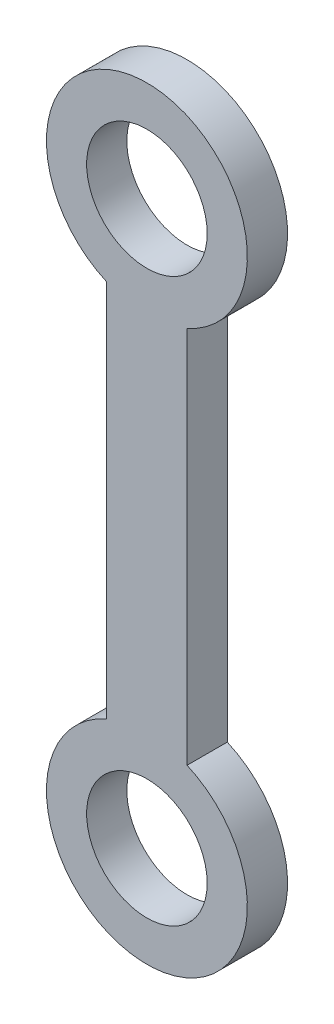
ISO-10303-21;
HEADER;
FILE_DESCRIPTION(('STEP AP214'),'2;1');
FILE_NAME('part.step','',(''),(''),'','','');
FILE_SCHEMA(('AUTOMOTIVE_DESIGN { 1 0 10303 214 1 1 1 1 }'));
ENDSEC;
DATA;
#1=APPLICATION_CONTEXT('core data for automotive mechanical design processes');
#2=APPLICATION_PROTOCOL_DEFINITION('international standard','automotive_design',2000,#1);
#3=PRODUCT_CONTEXT('',#1,'mechanical');
#4=PRODUCT('Part','Part','',(#3));
#5=PRODUCT_RELATED_PRODUCT_CATEGORY('part','',(#4));
#6=PRODUCT_DEFINITION_FORMATION('','',#4);
#7=PRODUCT_DEFINITION_CONTEXT('part definition',#1,'design');
#8=PRODUCT_DEFINITION('design','',#6,#7);
#9=PRODUCT_DEFINITION_SHAPE('','',#8);
#10=(LENGTH_UNIT() NAMED_UNIT(*) SI_UNIT(.MILLI.,.METRE.));
#11=(NAMED_UNIT(*) PLANE_ANGLE_UNIT() SI_UNIT($,.RADIAN.));
#12=(NAMED_UNIT(*) SI_UNIT($,.STERADIAN.) SOLID_ANGLE_UNIT());
#13=UNCERTAINTY_MEASURE_WITH_UNIT(LENGTH_MEASURE(1.E-05),#10,'distance_accuracy_value','');
#14=(GEOMETRIC_REPRESENTATION_CONTEXT(3) GLOBAL_UNCERTAINTY_ASSIGNED_CONTEXT((#13)) GLOBAL_UNIT_ASSIGNED_CONTEXT((#10,
#11,#12)) REPRESENTATION_CONTEXT('',''));
#15=CARTESIAN_POINT('',(0.,0.,0.));
#16=DIRECTION('',(0.,0.,1.));
#17=DIRECTION('',(1.,0.,0.));
#18=AXIS2_PLACEMENT_3D('',#15,#16,#17);
#19=CARTESIAN_POINT('',(0.,140.,10.));
#20=DIRECTION('',(0.,0.,-1.));
#21=DIRECTION('',(-1.,0.,0.));
#22=AXIS2_PLACEMENT_3D('',#19,#20,#21);
#23=PLANE('',#22);
#24=CARTESIAN_POINT('',(0.,0.,10.));
#25=DIRECTION('',(0.,0.,1.));
#26=DIRECTION('',(1.,0.,0.));
#27=AXIS2_PLACEMENT_3D('',#24,#25,#26);
#28=CIRCLE('',#27,15.);
#29=CARTESIAN_POINT('',(15.,0.,10.));
#30=VERTEX_POINT('',#29);
#31=EDGE_CURVE('E102',#30,#30,#28,.T.);
#32=ORIENTED_EDGE('',*,*,#31,.F.);
#33=EDGE_LOOP('',(#32));
#34=FACE_BOUND('',#33,.T.);
#35=CARTESIAN_POINT('',(0.,140.,10.));
#36=DIRECTION('',(0.,0.,1.));
#37=DIRECTION('',(-1.,0.,0.));
#38=AXIS2_PLACEMENT_3D('',#35,#36,#37);
#39=CIRCLE('',#38,25.);
#40=CARTESIAN_POINT('',(10.,117.087121525221,10.));
#41=VERTEX_POINT('',#40);
#42=CARTESIAN_POINT('',(-9.99999999999996,117.087121525221,10.));
#43=VERTEX_POINT('',#42);
#44=EDGE_CURVE('E87',#41,#43,#39,.T.);
#45=ORIENTED_EDGE('',*,*,#44,.T.);
#46=DIRECTION('',(0.,-1.,0.));
#47=VECTOR('',#46,1.);
#48=CARTESIAN_POINT('',(-9.99999999999996,117.087121525221,10.));
#49=LINE('',#48,#47);
#50=CARTESIAN_POINT('',(-9.99999999999998,22.9128784747792,10.));
#51=VERTEX_POINT('',#50);
#52=EDGE_CURVE('E82',#43,#51,#49,.T.);
#53=ORIENTED_EDGE('',*,*,#52,.T.);
#54=CARTESIAN_POINT('',(0.,0.,10.));
#55=DIRECTION('',(0.,0.,1.));
#56=DIRECTION('',(1.,0.,0.));
#57=AXIS2_PLACEMENT_3D('',#54,#55,#56);
#58=CIRCLE('',#57,25.);
#59=CARTESIAN_POINT('',(9.99999999999998,22.9128784747792,10.));
#60=VERTEX_POINT('',#59);
#61=EDGE_CURVE('E85',#51,#60,#58,.T.);
#62=ORIENTED_EDGE('',*,*,#61,.T.);
#63=DIRECTION('',(0.,1.,0.));
#64=VECTOR('',#63,1.);
#65=CARTESIAN_POINT('',(10.,117.087121525221,10.));
#66=LINE('',#65,#64);
#67=EDGE_CURVE('E52',#60,#41,#66,.T.);
#68=ORIENTED_EDGE('',*,*,#67,.T.);
#69=EDGE_LOOP('',(#45,#53,#62,#68));
#70=FACE_BOUND('',#69,.T.);
#71=CARTESIAN_POINT('',(0.,140.,10.));
#72=DIRECTION('',(0.,0.,1.));
#73=DIRECTION('',(1.,0.,0.));
#74=AXIS2_PLACEMENT_3D('',#71,#72,#73);
#75=CIRCLE('',#74,15.);
#76=CARTESIAN_POINT('',(15.,140.,10.));
#77=VERTEX_POINT('',#76);
#78=EDGE_CURVE('E117',#77,#77,#75,.T.);
#79=ORIENTED_EDGE('',*,*,#78,.F.);
#80=EDGE_LOOP('',(#79));
#81=FACE_BOUND('',#80,.T.);
#82=ADVANCED_FACE('F35',(#34,#70,#81),#23,.F.);
#83=CARTESIAN_POINT('',(0.,140.,0.));
#84=DIRECTION('',(0.,0.,-1.));
#85=DIRECTION('',(-1.,0.,0.));
#86=AXIS2_PLACEMENT_3D('',#83,#84,#85);
#87=PLANE('',#86);
#88=CARTESIAN_POINT('',(0.,0.,0.));
#89=DIRECTION('',(0.,0.,1.));
#90=DIRECTION('',(1.,0.,0.));
#91=AXIS2_PLACEMENT_3D('',#88,#89,#90);
#92=CIRCLE('',#91,15.);
#93=CARTESIAN_POINT('',(15.,0.,0.));
#94=VERTEX_POINT('',#93);
#95=EDGE_CURVE('E114',#94,#94,#92,.T.);
#96=ORIENTED_EDGE('',*,*,#95,.T.);
#97=EDGE_LOOP('',(#96));
#98=FACE_BOUND('',#97,.T.);
#99=CARTESIAN_POINT('',(0.,140.,0.));
#100=DIRECTION('',(0.,0.,1.));
#101=DIRECTION('',(-1.,0.,0.));
#102=AXIS2_PLACEMENT_3D('',#99,#100,#101);
#103=CIRCLE('',#102,25.);
#104=CARTESIAN_POINT('',(10.,117.087121525221,0.));
#105=VERTEX_POINT('',#104);
#106=CARTESIAN_POINT('',(-9.99999999999996,117.087121525221,0.));
#107=VERTEX_POINT('',#106);
#108=EDGE_CURVE('E99',#105,#107,#103,.T.);
#109=ORIENTED_EDGE('',*,*,#108,.F.);
#110=DIRECTION('',(0.,1.,0.));
#111=VECTOR('',#110,1.);
#112=CARTESIAN_POINT('',(10.,117.087121525221,0.));
#113=LINE('',#112,#111);
#114=CARTESIAN_POINT('',(9.99999999999998,22.9128784747792,0.));
#115=VERTEX_POINT('',#114);
#116=EDGE_CURVE('E75',#115,#105,#113,.T.);
#117=ORIENTED_EDGE('',*,*,#116,.F.);
#118=CARTESIAN_POINT('',(0.,0.,0.));
#119=DIRECTION('',(0.,0.,1.));
#120=DIRECTION('',(1.,0.,0.));
#121=AXIS2_PLACEMENT_3D('',#118,#119,#120);
#122=CIRCLE('',#121,25.);
#123=CARTESIAN_POINT('',(-9.99999999999998,22.9128784747792,0.));
#124=VERTEX_POINT('',#123);
#125=EDGE_CURVE('E69',#124,#115,#122,.T.);
#126=ORIENTED_EDGE('',*,*,#125,.F.);
#127=DIRECTION('',(0.,-1.,0.));
#128=VECTOR('',#127,1.);
#129=CARTESIAN_POINT('',(-9.99999999999996,117.087121525221,0.));
#130=LINE('',#129,#128);
#131=EDGE_CURVE('E91',#107,#124,#130,.T.);
#132=ORIENTED_EDGE('',*,*,#131,.F.);
#133=EDGE_LOOP('',(#109,#117,#126,#132));
#134=FACE_BOUND('',#133,.T.);
#135=CARTESIAN_POINT('',(0.,140.,0.));
#136=DIRECTION('',(0.,0.,1.));
#137=DIRECTION('',(1.,0.,0.));
#138=AXIS2_PLACEMENT_3D('',#135,#136,#137);
#139=CIRCLE('',#138,15.);
#140=CARTESIAN_POINT('',(15.,140.,0.));
#141=VERTEX_POINT('',#140);
#142=EDGE_CURVE('E120',#141,#141,#139,.T.);
#143=ORIENTED_EDGE('',*,*,#142,.T.);
#144=EDGE_LOOP('',(#143));
#145=FACE_BOUND('',#144,.T.);
#146=ADVANCED_FACE('F110',(#98,#134,#145),#87,.T.);
#147=CARTESIAN_POINT('',(0.,140.,10.));
#148=DIRECTION('',(0.,0.,-1.));
#149=DIRECTION('',(-1.,0.,0.));
#150=AXIS2_PLACEMENT_3D('',#147,#148,#149);
#151=CYLINDRICAL_SURFACE('',#150,25.);
#152=ORIENTED_EDGE('',*,*,#108,.T.);
#153=DIRECTION('',(0.,0.,-1.));
#154=VECTOR('',#153,1.);
#155=CARTESIAN_POINT('',(-9.99999999999996,117.087121525221,10.));
#156=LINE('',#155,#154);
#157=EDGE_CURVE('E11',#43,#107,#156,.T.);
#158=ORIENTED_EDGE('',*,*,#157,.F.);
#159=ORIENTED_EDGE('',*,*,#44,.F.);
#160=DIRECTION('',(0.,0.,-1.));
#161=VECTOR('',#160,1.);
#162=CARTESIAN_POINT('',(10.,117.087121525221,10.));
#163=LINE('',#162,#161);
#164=EDGE_CURVE('E95',#41,#105,#163,.T.);
#165=ORIENTED_EDGE('',*,*,#164,.T.);
#166=EDGE_LOOP('',(#152,#158,#159,#165));
#167=FACE_BOUND('',#166,.T.);
#168=ADVANCED_FACE('F37',(#167),#151,.T.);
#169=CARTESIAN_POINT('',(-9.99999999999996,117.087121525221,10.));
#170=DIRECTION('',(1.,0.,0.));
#171=DIRECTION('',(0.,1.,0.));
#172=AXIS2_PLACEMENT_3D('',#169,#170,#171);
#173=PLANE('',#172);
#174=ORIENTED_EDGE('',*,*,#131,.T.);
#175=DIRECTION('',(0.,0.,-1.));
#176=VECTOR('',#175,1.);
#177=CARTESIAN_POINT('',(-9.99999999999998,22.9128784747792,10.));
#178=LINE('',#177,#176);
#179=EDGE_CURVE('E44',#51,#124,#178,.T.);
#180=ORIENTED_EDGE('',*,*,#179,.F.);
#181=ORIENTED_EDGE('',*,*,#52,.F.);
#182=ORIENTED_EDGE('',*,*,#157,.T.);
#183=EDGE_LOOP('',(#174,#180,#181,#182));
#184=FACE_BOUND('',#183,.T.);
#185=ADVANCED_FACE('F90',(#184),#173,.F.);
#186=CARTESIAN_POINT('',(0.,0.,10.));
#187=DIRECTION('',(0.,0.,-1.));
#188=DIRECTION('',(-1.,0.,0.));
#189=AXIS2_PLACEMENT_3D('',#186,#187,#188);
#190=CYLINDRICAL_SURFACE('',#189,25.);
#191=ORIENTED_EDGE('',*,*,#125,.T.);
#192=DIRECTION('',(0.,0.,-1.));
#193=VECTOR('',#192,1.);
#194=CARTESIAN_POINT('',(9.99999999999998,22.9128784747792,10.));
#195=LINE('',#194,#193);
#196=EDGE_CURVE('E92',#60,#115,#195,.T.);
#197=ORIENTED_EDGE('',*,*,#196,.F.);
#198=ORIENTED_EDGE('',*,*,#61,.F.);
#199=ORIENTED_EDGE('',*,*,#179,.T.);
#200=EDGE_LOOP('',(#191,#197,#198,#199));
#201=FACE_BOUND('',#200,.T.);
#202=ADVANCED_FACE('F93',(#201),#190,.T.);
#203=CARTESIAN_POINT('',(10.,117.087121525221,10.));
#204=DIRECTION('',(-1.,0.,0.));
#205=DIRECTION('',(0.,-1.,0.));
#206=AXIS2_PLACEMENT_3D('',#203,#204,#205);
#207=PLANE('',#206);
#208=ORIENTED_EDGE('',*,*,#116,.T.);
#209=ORIENTED_EDGE('',*,*,#164,.F.);
#210=ORIENTED_EDGE('',*,*,#67,.F.);
#211=ORIENTED_EDGE('',*,*,#196,.T.);
#212=EDGE_LOOP('',(#208,#209,#210,#211));
#213=FACE_BOUND('',#212,.T.);
#214=ADVANCED_FACE('F107',(#213),#207,.F.);
#215=CARTESIAN_POINT('',(0.,0.,10.));
#216=DIRECTION('',(0.,0.,-1.));
#217=DIRECTION('',(-1.,0.,0.));
#218=AXIS2_PLACEMENT_3D('',#215,#216,#217);
#219=CYLINDRICAL_SURFACE('',#218,15.);
#220=ORIENTED_EDGE('',*,*,#31,.T.);
#221=EDGE_LOOP('',(#220));
#222=FACE_BOUND('',#221,.T.);
#223=ORIENTED_EDGE('',*,*,#95,.F.);
#224=EDGE_LOOP('',(#223));
#225=FACE_BOUND('',#224,.T.);
#226=ADVANCED_FACE('F138',(#222,#225),#219,.F.);
#227=CARTESIAN_POINT('',(0.,140.,10.));
#228=DIRECTION('',(0.,0.,-1.));
#229=DIRECTION('',(-1.,0.,0.));
#230=AXIS2_PLACEMENT_3D('',#227,#228,#229);
#231=CYLINDRICAL_SURFACE('',#230,15.);
#232=ORIENTED_EDGE('',*,*,#78,.T.);
#233=EDGE_LOOP('',(#232));
#234=FACE_BOUND('',#233,.T.);
#235=ORIENTED_EDGE('',*,*,#142,.F.);
#236=EDGE_LOOP('',(#235));
#237=FACE_BOUND('',#236,.T.);
#238=ADVANCED_FACE('F126',(#234,#237),#231,.F.);
#239=CLOSED_SHELL('',(#82,#146,#168,#185,#202,#214,#226,#238));
#240=MANIFOLD_SOLID_BREP('B2',#239);
#241=ADVANCED_BREP_SHAPE_REPRESENTATION('',(#18,#240),#14);
#242=SHAPE_DEFINITION_REPRESENTATION(#9,#241);
ENDSEC;
END-ISO-10303-21;
